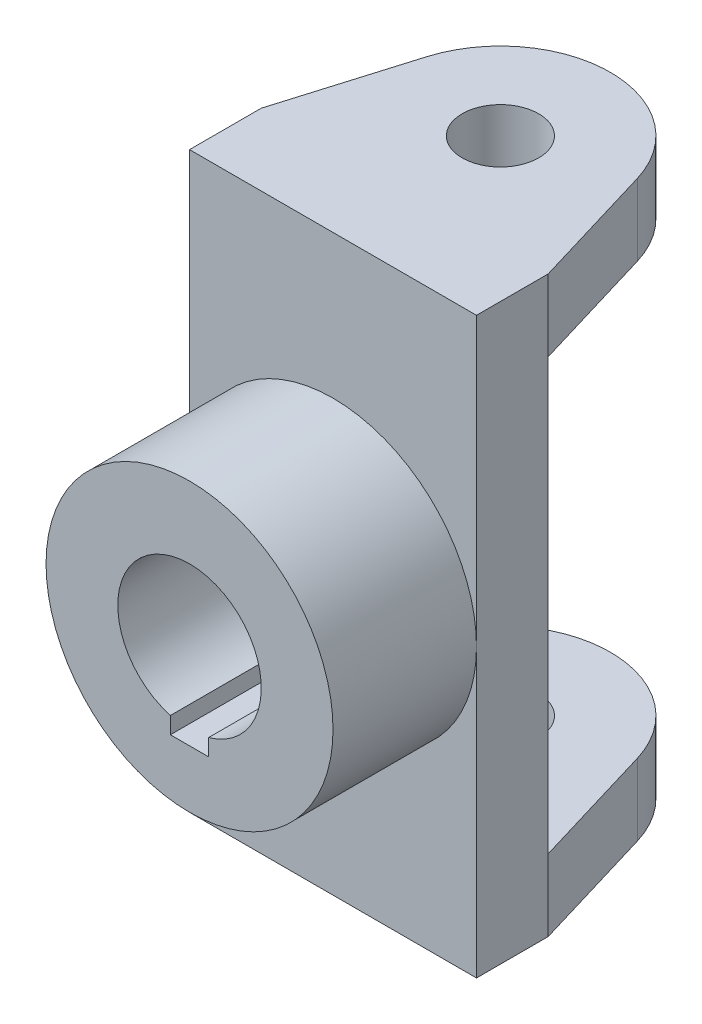
ISO-10303-21;
HEADER;
FILE_DESCRIPTION(('STEP AP214'),'2;1');
FILE_NAME('part.step','',(''),(''),'','','');
FILE_SCHEMA(('AUTOMOTIVE_DESIGN { 1 0 10303 214 1 1 1 1 }'));
ENDSEC;
DATA;
#1=APPLICATION_CONTEXT('core data for automotive mechanical design processes');
#2=APPLICATION_PROTOCOL_DEFINITION('international standard','automotive_design',2000,#1);
#3=PRODUCT_CONTEXT('',#1,'mechanical');
#4=PRODUCT('Part','Part','',(#3));
#5=PRODUCT_RELATED_PRODUCT_CATEGORY('part','',(#4));
#6=PRODUCT_DEFINITION_FORMATION('','',#4);
#7=PRODUCT_DEFINITION_CONTEXT('part definition',#1,'design');
#8=PRODUCT_DEFINITION('design','',#6,#7);
#9=PRODUCT_DEFINITION_SHAPE('','',#8);
#10=(LENGTH_UNIT() NAMED_UNIT(*) SI_UNIT(.MILLI.,.METRE.));
#11=(NAMED_UNIT(*) PLANE_ANGLE_UNIT() SI_UNIT($,.RADIAN.));
#12=(NAMED_UNIT(*) SI_UNIT($,.STERADIAN.) SOLID_ANGLE_UNIT());
#13=UNCERTAINTY_MEASURE_WITH_UNIT(LENGTH_MEASURE(1.E-05),#10,'distance_accuracy_value','');
#14=(GEOMETRIC_REPRESENTATION_CONTEXT(3) GLOBAL_UNCERTAINTY_ASSIGNED_CONTEXT((#13)) GLOBAL_UNIT_ASSIGNED_CONTEXT((#10,
#11,#12)) REPRESENTATION_CONTEXT('',''));
#15=CARTESIAN_POINT('',(0.,0.,0.));
#16=DIRECTION('',(0.,0.,1.));
#17=DIRECTION('',(1.,0.,0.));
#18=AXIS2_PLACEMENT_3D('',#15,#16,#17);
#19=CARTESIAN_POINT('',(0.,0.,-30.));
#20=DIRECTION('',(0.,0.,1.));
#21=DIRECTION('',(1.,0.,0.));
#22=AXIS2_PLACEMENT_3D('',#19,#20,#21);
#23=CYLINDRICAL_SURFACE('',#22,30.);
#24=CARTESIAN_POINT('',(0.,0.,-30.));
#25=DIRECTION('',(0.,0.,1.));
#26=DIRECTION('',(1.,0.,0.));
#27=AXIS2_PLACEMENT_3D('',#24,#25,#26);
#28=CIRCLE('',#27,30.);
#29=CARTESIAN_POINT('',(30.,0.,-30.));
#30=VERTEX_POINT('',#29);
#31=CARTESIAN_POINT('',(-30.,0.,-30.));
#32=VERTEX_POINT('',#31);
#33=EDGE_CURVE('E11',#30,#32,#28,.T.);
#34=ORIENTED_EDGE('',*,*,#33,.T.);
#35=EDGE_CURVE('E54',#32,#30,#28,.T.);
#36=ORIENTED_EDGE('',*,*,#35,.T.);
#37=EDGE_LOOP('',(#34,#36));
#38=FACE_BOUND('',#37,.T.);
#39=CARTESIAN_POINT('',(0.,0.,0.));
#40=DIRECTION('',(0.,0.,1.));
#41=DIRECTION('',(1.,0.,0.));
#42=AXIS2_PLACEMENT_3D('',#39,#40,#41);
#43=CIRCLE('',#42,30.);
#44=CARTESIAN_POINT('',(30.,0.,0.));
#45=VERTEX_POINT('',#44);
#46=EDGE_CURVE('E48',#45,#45,#43,.T.);
#47=ORIENTED_EDGE('',*,*,#46,.F.);
#48=EDGE_LOOP('',(#47));
#49=FACE_BOUND('',#48,.T.);
#50=ADVANCED_FACE('F45',(#38,#49),#23,.T.);
#51=CARTESIAN_POINT('',(0.,0.,0.));
#52=DIRECTION('',(0.,0.,1.));
#53=DIRECTION('',(1.,0.,0.));
#54=AXIS2_PLACEMENT_3D('',#51,#52,#53);
#55=PLANE('',#54);
#56=CARTESIAN_POINT('',(0.,0.,0.));
#57=DIRECTION('',(0.,0.,1.));
#58=DIRECTION('',(1.,0.,0.));
#59=AXIS2_PLACEMENT_3D('',#56,#57,#58);
#60=CIRCLE('',#59,15.);
#61=CARTESIAN_POINT('',(4.,-14.456832294801,0.));
#62=VERTEX_POINT('',#61);
#63=CARTESIAN_POINT('',(-4.,-14.456832294801,0.));
#64=VERTEX_POINT('',#63);
#65=EDGE_CURVE('E288',#62,#64,#60,.T.);
#66=ORIENTED_EDGE('',*,*,#65,.F.);
#67=DIRECTION('',(0.,1.,0.));
#68=VECTOR('',#67,1.);
#69=CARTESIAN_POINT('',(4.,-14.456832294801,0.));
#70=LINE('',#69,#68);
#71=CARTESIAN_POINT('',(4.,-17.956832294801,0.));
#72=VERTEX_POINT('',#71);
#73=EDGE_CURVE('E300',#72,#62,#70,.T.);
#74=ORIENTED_EDGE('',*,*,#73,.F.);
#75=DIRECTION('',(1.,0.,0.));
#76=VECTOR('',#75,1.);
#77=CARTESIAN_POINT('',(-4.,-17.956832294801,0.));
#78=LINE('',#77,#76);
#79=CARTESIAN_POINT('',(-4.,-17.956832294801,0.));
#80=VERTEX_POINT('',#79);
#81=EDGE_CURVE('E317',#80,#72,#78,.T.);
#82=ORIENTED_EDGE('',*,*,#81,.F.);
#83=DIRECTION('',(0.,-1.,0.));
#84=VECTOR('',#83,1.);
#85=CARTESIAN_POINT('',(-4.,-14.456832294801,0.));
#86=LINE('',#85,#84);
#87=EDGE_CURVE('E313',#64,#80,#86,.T.);
#88=ORIENTED_EDGE('',*,*,#87,.F.);
#89=EDGE_LOOP('',(#66,#74,#82,#88));
#90=FACE_BOUND('',#89,.T.);
#91=ORIENTED_EDGE('',*,*,#46,.T.);
#92=EDGE_LOOP('',(#91));
#93=FACE_BOUND('',#92,.T.);
#94=ADVANCED_FACE('F344',(#90,#93),#55,.T.);
#95=CARTESIAN_POINT('',(0.,0.,-30.));
#96=DIRECTION('',(0.,0.,1.));
#97=DIRECTION('',(1.,0.,0.));
#98=AXIS2_PLACEMENT_3D('',#95,#96,#97);
#99=CYLINDRICAL_SURFACE('',#98,15.);
#100=ORIENTED_EDGE('',*,*,#65,.T.);
#101=DIRECTION('',(0.,0.,1.));
#102=VECTOR('',#101,1.);
#103=CARTESIAN_POINT('',(-4.,-14.456832294801,-30.));
#104=LINE('',#103,#102);
#105=CARTESIAN_POINT('',(-4.,-14.456832294801,-30.));
#106=VERTEX_POINT('',#105);
#107=EDGE_CURVE('E310',#106,#64,#104,.T.);
#108=ORIENTED_EDGE('',*,*,#107,.F.);
#109=CARTESIAN_POINT('',(0.,0.,-30.));
#110=DIRECTION('',(0.,0.,1.));
#111=DIRECTION('',(1.,0.,0.));
#112=AXIS2_PLACEMENT_3D('',#109,#110,#111);
#113=CIRCLE('',#112,15.);
#114=CARTESIAN_POINT('',(4.,-14.456832294801,-30.));
#115=VERTEX_POINT('',#114);
#116=EDGE_CURVE('E295',#115,#106,#113,.T.);
#117=ORIENTED_EDGE('',*,*,#116,.F.);
#118=DIRECTION('',(0.,0.,1.));
#119=VECTOR('',#118,1.);
#120=CARTESIAN_POINT('',(4.,-14.456832294801,-30.));
#121=LINE('',#120,#119);
#122=EDGE_CURVE('E324',#115,#62,#121,.T.);
#123=ORIENTED_EDGE('',*,*,#122,.T.);
#124=EDGE_LOOP('',(#100,#108,#117,#123));
#125=FACE_BOUND('',#124,.T.);
#126=ADVANCED_FACE('F350',(#125),#99,.F.);
#127=CARTESIAN_POINT('',(4.,-14.456832294801,-30.));
#128=DIRECTION('',(1.,0.,0.));
#129=DIRECTION('',(0.,1.,0.));
#130=AXIS2_PLACEMENT_3D('',#127,#128,#129);
#131=PLANE('',#130);
#132=ORIENTED_EDGE('',*,*,#73,.T.);
#133=ORIENTED_EDGE('',*,*,#122,.F.);
#134=DIRECTION('',(0.,1.,0.));
#135=VECTOR('',#134,1.);
#136=CARTESIAN_POINT('',(4.,-14.456832294801,-30.));
#137=LINE('',#136,#135);
#138=CARTESIAN_POINT('',(4.,-17.956832294801,-30.));
#139=VERTEX_POINT('',#138);
#140=EDGE_CURVE('E306',#139,#115,#137,.T.);
#141=ORIENTED_EDGE('',*,*,#140,.F.);
#142=DIRECTION('',(0.,0.,1.));
#143=VECTOR('',#142,1.);
#144=CARTESIAN_POINT('',(4.,-17.956832294801,-30.));
#145=LINE('',#144,#143);
#146=EDGE_CURVE('E327',#139,#72,#145,.T.);
#147=ORIENTED_EDGE('',*,*,#146,.T.);
#148=EDGE_LOOP('',(#132,#133,#141,#147));
#149=FACE_BOUND('',#148,.T.);
#150=ADVANCED_FACE('F352',(#149),#131,.F.);
#151=CARTESIAN_POINT('',(-4.,-17.956832294801,-30.));
#152=DIRECTION('',(0.,-1.,0.));
#153=DIRECTION('',(0.,0.,-1.));
#154=AXIS2_PLACEMENT_3D('',#151,#152,#153);
#155=PLANE('',#154);
#156=ORIENTED_EDGE('',*,*,#81,.T.);
#157=ORIENTED_EDGE('',*,*,#146,.F.);
#158=DIRECTION('',(1.,0.,0.));
#159=VECTOR('',#158,1.);
#160=CARTESIAN_POINT('',(-4.,-17.956832294801,-30.));
#161=LINE('',#160,#159);
#162=CARTESIAN_POINT('',(-4.,-17.956832294801,-30.));
#163=VERTEX_POINT('',#162);
#164=EDGE_CURVE('E69',#163,#139,#161,.T.);
#165=ORIENTED_EDGE('',*,*,#164,.F.);
#166=DIRECTION('',(0.,0.,1.));
#167=VECTOR('',#166,1.);
#168=CARTESIAN_POINT('',(-4.,-17.956832294801,-30.));
#169=LINE('',#168,#167);
#170=EDGE_CURVE('E330',#163,#80,#169,.T.);
#171=ORIENTED_EDGE('',*,*,#170,.T.);
#172=EDGE_LOOP('',(#156,#157,#165,#171));
#173=FACE_BOUND('',#172,.T.);
#174=ADVANCED_FACE('F347',(#173),#155,.F.);
#175=CARTESIAN_POINT('',(-4.,-14.456832294801,-30.));
#176=DIRECTION('',(-1.,0.,0.));
#177=DIRECTION('',(0.,-1.,0.));
#178=AXIS2_PLACEMENT_3D('',#175,#176,#177);
#179=PLANE('',#178);
#180=ORIENTED_EDGE('',*,*,#87,.T.);
#181=ORIENTED_EDGE('',*,*,#170,.F.);
#182=DIRECTION('',(0.,-1.,0.));
#183=VECTOR('',#182,1.);
#184=CARTESIAN_POINT('',(-4.,-14.456832294801,-30.));
#185=LINE('',#184,#183);
#186=EDGE_CURVE('E299',#106,#163,#185,.T.);
#187=ORIENTED_EDGE('',*,*,#186,.F.);
#188=ORIENTED_EDGE('',*,*,#107,.T.);
#189=EDGE_LOOP('',(#180,#181,#187,#188));
#190=FACE_BOUND('',#189,.T.);
#191=ADVANCED_FACE('F338',(#190),#179,.F.);
#192=CARTESIAN_POINT('',(0.,0.,-30.));
#193=DIRECTION('',(0.,0.,-1.));
#194=DIRECTION('',(-1.,0.,0.));
#195=AXIS2_PLACEMENT_3D('',#192,#193,#194);
#196=PLANE('',#195);
#197=ORIENTED_EDGE('',*,*,#35,.F.);
#198=DIRECTION('',(0.,1.,0.));
#199=VECTOR('',#198,1.);
#200=CARTESIAN_POINT('',(-30.,45.,-30.));
#201=LINE('',#200,#199);
#202=CARTESIAN_POINT('',(-30.,-60.,-30.));
#203=VERTEX_POINT('',#202);
#204=EDGE_CURVE('E289',#203,#32,#201,.T.);
#205=ORIENTED_EDGE('',*,*,#204,.F.);
#206=DIRECTION('',(1.,0.,0.));
#207=VECTOR('',#206,1.);
#208=CARTESIAN_POINT('',(-30.,-60.,-30.));
#209=LINE('',#208,#207);
#210=CARTESIAN_POINT('',(30.,-60.,-30.));
#211=VERTEX_POINT('',#210);
#212=EDGE_CURVE('E180',#203,#211,#209,.T.);
#213=ORIENTED_EDGE('',*,*,#212,.T.);
#214=DIRECTION('',(0.,-1.,0.));
#215=VECTOR('',#214,1.);
#216=CARTESIAN_POINT('',(30.,45.,-30.));
#217=LINE('',#216,#215);
#218=EDGE_CURVE('E292',#30,#211,#217,.T.);
#219=ORIENTED_EDGE('',*,*,#218,.F.);
#220=EDGE_LOOP('',(#197,#205,#213,#219));
#221=FACE_BOUND('',#220,.T.);
#222=ADVANCED_FACE('F376',(#221),#196,.F.);
#223=CARTESIAN_POINT('',(0.,0.,-45.));
#224=DIRECTION('',(0.,0.,-1.));
#225=DIRECTION('',(-1.,0.,0.));
#226=AXIS2_PLACEMENT_3D('',#223,#224,#225);
#227=PLANE('',#226);
#228=DIRECTION('',(0.,1.,0.));
#229=VECTOR('',#228,1.);
#230=CARTESIAN_POINT('',(-30.,45.,-45.));
#231=LINE('',#230,#229);
#232=CARTESIAN_POINT('',(-30.,-45.,-45.));
#233=VERTEX_POINT('',#232);
#234=CARTESIAN_POINT('',(-30.,45.,-45.));
#235=VERTEX_POINT('',#234);
#236=EDGE_CURVE('E163',#233,#235,#231,.T.);
#237=ORIENTED_EDGE('',*,*,#236,.T.);
#238=DIRECTION('',(1.,0.,0.));
#239=VECTOR('',#238,1.);
#240=CARTESIAN_POINT('',(30.,45.,-45.));
#241=LINE('',#240,#239);
#242=CARTESIAN_POINT('',(30.,45.,-45.));
#243=VERTEX_POINT('',#242);
#244=EDGE_CURVE('E277',#235,#243,#241,.T.);
#245=ORIENTED_EDGE('',*,*,#244,.T.);
#246=DIRECTION('',(0.,-1.,0.));
#247=VECTOR('',#246,1.);
#248=CARTESIAN_POINT('',(30.,45.,-45.));
#249=LINE('',#248,#247);
#250=CARTESIAN_POINT('',(30.,-45.,-45.));
#251=VERTEX_POINT('',#250);
#252=EDGE_CURVE('E281',#243,#251,#249,.T.);
#253=ORIENTED_EDGE('',*,*,#252,.T.);
#254=DIRECTION('',(-1.,0.,0.));
#255=VECTOR('',#254,1.);
#256=CARTESIAN_POINT('',(30.,-45.,-45.));
#257=LINE('',#256,#255);
#258=EDGE_CURVE('E285',#251,#233,#257,.T.);
#259=ORIENTED_EDGE('',*,*,#258,.T.);
#260=EDGE_LOOP('',(#237,#245,#253,#259));
#261=FACE_BOUND('',#260,.T.);
#262=ADVANCED_FACE('F393',(#261),#227,.T.);
#263=CARTESIAN_POINT('',(30.,45.,-45.));
#264=DIRECTION('',(-1.,0.,0.));
#265=DIRECTION('',(0.,-1.,0.));
#266=AXIS2_PLACEMENT_3D('',#263,#264,#265);
#267=PLANE('',#266);
#268=CARTESIAN_POINT('',(30.,60.,-30.));
#269=VERTEX_POINT('',#268);
#270=EDGE_CURVE('E61',#269,#30,#217,.T.);
#271=ORIENTED_EDGE('',*,*,#270,.T.);
#272=ORIENTED_EDGE('',*,*,#218,.T.);
#273=DIRECTION('',(0.,0.,-1.));
#274=VECTOR('',#273,1.);
#275=CARTESIAN_POINT('',(30.,-60.,-45.));
#276=LINE('',#275,#274);
#277=CARTESIAN_POINT('',(30.,-60.,-45.));
#278=VERTEX_POINT('',#277);
#279=EDGE_CURVE('E196',#211,#278,#276,.T.);
#280=ORIENTED_EDGE('',*,*,#279,.T.);
#281=DIRECTION('',(0.,1.,0.));
#282=VECTOR('',#281,1.);
#283=CARTESIAN_POINT('',(30.,-60.,-45.));
#284=LINE('',#283,#282);
#285=EDGE_CURVE('E202',#278,#251,#284,.T.);
#286=ORIENTED_EDGE('',*,*,#285,.T.);
#287=ORIENTED_EDGE('',*,*,#252,.F.);
#288=DIRECTION('',(0.,-1.,0.));
#289=VECTOR('',#288,1.);
#290=CARTESIAN_POINT('',(30.,60.,-45.));
#291=LINE('',#290,#289);
#292=CARTESIAN_POINT('',(30.,60.,-45.));
#293=VERTEX_POINT('',#292);
#294=EDGE_CURVE('E270',#293,#243,#291,.T.);
#295=ORIENTED_EDGE('',*,*,#294,.F.);
#296=DIRECTION('',(0.,0.,-1.));
#297=VECTOR('',#296,1.);
#298=CARTESIAN_POINT('',(30.,60.,-45.));
#299=LINE('',#298,#297);
#300=EDGE_CURVE('E239',#269,#293,#299,.T.);
#301=ORIENTED_EDGE('',*,*,#300,.F.);
#302=EDGE_LOOP('',(#271,#272,#280,#286,#287,#295,#301));
#303=FACE_BOUND('',#302,.T.);
#304=ADVANCED_FACE('F383',(#303),#267,.F.);
#305=CARTESIAN_POINT('',(-30.,45.,-45.));
#306=DIRECTION('',(1.,0.,0.));
#307=DIRECTION('',(0.,1.,0.));
#308=AXIS2_PLACEMENT_3D('',#305,#306,#307);
#309=PLANE('',#308);
#310=ORIENTED_EDGE('',*,*,#204,.T.);
#311=CARTESIAN_POINT('',(-30.,60.,-30.));
#312=VERTEX_POINT('',#311);
#313=EDGE_CURVE('E274',#32,#312,#201,.T.);
#314=ORIENTED_EDGE('',*,*,#313,.T.);
#315=DIRECTION('',(0.,0.,1.));
#316=VECTOR('',#315,1.);
#317=CARTESIAN_POINT('',(-30.,60.,-45.));
#318=LINE('',#317,#316);
#319=CARTESIAN_POINT('',(-30.,60.,-45.));
#320=VERTEX_POINT('',#319);
#321=EDGE_CURVE('E230',#320,#312,#318,.T.);
#322=ORIENTED_EDGE('',*,*,#321,.F.);
#323=DIRECTION('',(0.,-1.,0.));
#324=VECTOR('',#323,1.);
#325=CARTESIAN_POINT('',(-30.,60.,-45.));
#326=LINE('',#325,#324);
#327=EDGE_CURVE('E251',#320,#235,#326,.T.);
#328=ORIENTED_EDGE('',*,*,#327,.T.);
#329=ORIENTED_EDGE('',*,*,#236,.F.);
#330=DIRECTION('',(0.,1.,0.));
#331=VECTOR('',#330,1.);
#332=CARTESIAN_POINT('',(-30.,-60.,-45.));
#333=LINE('',#332,#331);
#334=CARTESIAN_POINT('',(-30.,-60.,-45.));
#335=VERTEX_POINT('',#334);
#336=EDGE_CURVE('E155',#335,#233,#333,.T.);
#337=ORIENTED_EDGE('',*,*,#336,.F.);
#338=DIRECTION('',(0.,0.,1.));
#339=VECTOR('',#338,1.);
#340=CARTESIAN_POINT('',(-30.,-60.,-45.));
#341=LINE('',#340,#339);
#342=EDGE_CURVE('E159',#335,#203,#341,.T.);
#343=ORIENTED_EDGE('',*,*,#342,.T.);
#344=EDGE_LOOP('',(#310,#314,#322,#328,#329,#337,#343));
#345=FACE_BOUND('',#344,.T.);
#346=ADVANCED_FACE('F158',(#345),#309,.F.);
#347=ORIENTED_EDGE('',*,*,#33,.F.);
#348=ORIENTED_EDGE('',*,*,#270,.F.);
#349=DIRECTION('',(1.,0.,0.));
#350=VECTOR('',#349,1.);
#351=CARTESIAN_POINT('',(-30.,60.,-30.));
#352=LINE('',#351,#350);
#353=EDGE_CURVE('E234',#312,#269,#352,.T.);
#354=ORIENTED_EDGE('',*,*,#353,.F.);
#355=ORIENTED_EDGE('',*,*,#313,.F.);
#356=EDGE_LOOP('',(#347,#348,#354,#355));
#357=FACE_BOUND('',#356,.T.);
#358=ADVANCED_FACE('F379',(#357),#196,.F.);
#359=ORIENTED_EDGE('',*,*,#164,.T.);
#360=ORIENTED_EDGE('',*,*,#140,.T.);
#361=ORIENTED_EDGE('',*,*,#116,.T.);
#362=ORIENTED_EDGE('',*,*,#186,.T.);
#363=EDGE_LOOP('',(#359,#360,#361,#362));
#364=FACE_BOUND('',#363,.T.);
#365=ADVANCED_FACE('F349',(#364),#196,.F.);
#366=CARTESIAN_POINT('',(0.,60.,-65.));
#367=DIRECTION('',(0.,1.,0.));
#368=DIRECTION('',(-1.,0.,0.));
#369=AXIS2_PLACEMENT_3D('',#366,#367,#368);
#370=PLANE('',#369);
#371=ORIENTED_EDGE('',*,*,#321,.T.);
#372=ORIENTED_EDGE('',*,*,#353,.T.);
#373=ORIENTED_EDGE('',*,*,#300,.T.);
#374=DIRECTION('',(-0.286928155857607,0.,-0.957952103905071));
#375=VECTOR('',#374,1.);
#376=CARTESIAN_POINT('',(30.,60.,-45.));
#377=LINE('',#376,#375);
#378=CARTESIAN_POINT('',(22.0328983898167,60.,-71.599347584725));
#379=VERTEX_POINT('',#378);
#380=EDGE_CURVE('E242',#293,#379,#377,.T.);
#381=ORIENTED_EDGE('',*,*,#380,.T.);
#382=CARTESIAN_POINT('',(0.,60.,-65.));
#383=DIRECTION('',(0.,1.,0.));
#384=DIRECTION('',(-1.,0.,0.));
#385=AXIS2_PLACEMENT_3D('',#382,#383,#384);
#386=CIRCLE('',#385,23.);
#387=CARTESIAN_POINT('',(-22.0328983898166,60.,-71.599347584725));
#388=VERTEX_POINT('',#387);
#389=EDGE_CURVE('E245',#379,#388,#386,.T.);
#390=ORIENTED_EDGE('',*,*,#389,.T.);
#391=DIRECTION('',(-0.286928155857607,0.,0.957952103905071));
#392=VECTOR('',#391,1.);
#393=CARTESIAN_POINT('',(-30.,60.,-45.));
#394=LINE('',#393,#392);
#395=EDGE_CURVE('E248',#388,#320,#394,.T.);
#396=ORIENTED_EDGE('',*,*,#395,.T.);
#397=EDGE_LOOP('',(#371,#372,#373,#381,#390,#396));
#398=FACE_BOUND('',#397,.T.);
#399=CARTESIAN_POINT('',(0.,60.,-65.));
#400=DIRECTION('',(0.,1.,0.));
#401=DIRECTION('',(-1.,0.,0.));
#402=AXIS2_PLACEMENT_3D('',#399,#400,#401);
#403=CIRCLE('',#402,8.);
#404=CARTESIAN_POINT('',(-8.,60.,-65.));
#405=VERTEX_POINT('',#404);
#406=EDGE_CURVE('E222',#405,#405,#403,.T.);
#407=ORIENTED_EDGE('',*,*,#406,.F.);
#408=EDGE_LOOP('',(#407));
#409=FACE_BOUND('',#408,.T.);
#410=ADVANCED_FACE('F405',(#398,#409),#370,.T.);
#411=CARTESIAN_POINT('',(0.,45.,-65.));
#412=DIRECTION('',(0.,1.,0.));
#413=DIRECTION('',(-1.,0.,0.));
#414=AXIS2_PLACEMENT_3D('',#411,#412,#413);
#415=PLANE('',#414);
#416=ORIENTED_EDGE('',*,*,#244,.F.);
#417=DIRECTION('',(-0.286928155857607,0.,0.957952103905071));
#418=VECTOR('',#417,1.);
#419=CARTESIAN_POINT('',(-30.,45.,-45.));
#420=LINE('',#419,#418);
#421=CARTESIAN_POINT('',(-22.0328983898166,45.,-71.599347584725));
#422=VERTEX_POINT('',#421);
#423=EDGE_CURVE('E235',#422,#235,#420,.T.);
#424=ORIENTED_EDGE('',*,*,#423,.F.);
#425=CARTESIAN_POINT('',(0.,45.,-65.));
#426=DIRECTION('',(0.,1.,0.));
#427=DIRECTION('',(-1.,0.,0.));
#428=AXIS2_PLACEMENT_3D('',#425,#426,#427);
#429=CIRCLE('',#428,23.);
#430=CARTESIAN_POINT('',(22.0328983898167,45.,-71.599347584725));
#431=VERTEX_POINT('',#430);
#432=EDGE_CURVE('E254',#431,#422,#429,.T.);
#433=ORIENTED_EDGE('',*,*,#432,.F.);
#434=DIRECTION('',(-0.286928155857607,0.,-0.957952103905071));
#435=VECTOR('',#434,1.);
#436=CARTESIAN_POINT('',(30.,45.,-45.));
#437=LINE('',#436,#435);
#438=EDGE_CURVE('E226',#243,#431,#437,.T.);
#439=ORIENTED_EDGE('',*,*,#438,.F.);
#440=EDGE_LOOP('',(#416,#424,#433,#439));
#441=FACE_BOUND('',#440,.T.);
#442=CARTESIAN_POINT('',(0.,45.,-65.));
#443=DIRECTION('',(0.,1.,0.));
#444=DIRECTION('',(-1.,0.,0.));
#445=AXIS2_PLACEMENT_3D('',#442,#443,#444);
#446=CIRCLE('',#445,8.);
#447=CARTESIAN_POINT('',(-8.,45.,-65.));
#448=VERTEX_POINT('',#447);
#449=EDGE_CURVE('E169',#448,#448,#446,.T.);
#450=ORIENTED_EDGE('',*,*,#449,.T.);
#451=EDGE_LOOP('',(#450));
#452=FACE_BOUND('',#451,.T.);
#453=ADVANCED_FACE('F396',(#441,#452),#415,.F.);
#454=CARTESIAN_POINT('',(30.,60.,-45.));
#455=DIRECTION('',(-0.957952103905072,0.,0.286928155857607));
#456=DIRECTION('',(0.286928155857607,0.,0.957952103905072));
#457=AXIS2_PLACEMENT_3D('',#454,#455,#456);
#458=PLANE('',#457);
#459=ORIENTED_EDGE('',*,*,#438,.T.);
#460=DIRECTION('',(0.,-1.,0.));
#461=VECTOR('',#460,1.);
#462=CARTESIAN_POINT('',(22.0328983898167,60.,-71.599347584725));
#463=LINE('',#462,#461);
#464=EDGE_CURVE('E266',#379,#431,#463,.T.);
#465=ORIENTED_EDGE('',*,*,#464,.F.);
#466=ORIENTED_EDGE('',*,*,#380,.F.);
#467=ORIENTED_EDGE('',*,*,#294,.T.);
#468=EDGE_LOOP('',(#459,#465,#466,#467));
#469=FACE_BOUND('',#468,.T.);
#470=ADVANCED_FACE('F412',(#469),#458,.F.);
#471=CARTESIAN_POINT('',(0.,60.,-65.));
#472=DIRECTION('',(0.,-1.,0.));
#473=DIRECTION('',(1.,0.,0.));
#474=AXIS2_PLACEMENT_3D('',#471,#472,#473);
#475=CYLINDRICAL_SURFACE('',#474,23.);
#476=ORIENTED_EDGE('',*,*,#432,.T.);
#477=DIRECTION('',(0.,-1.,0.));
#478=VECTOR('',#477,1.);
#479=CARTESIAN_POINT('',(-22.0328983898166,60.,-71.599347584725));
#480=LINE('',#479,#478);
#481=EDGE_CURVE('E262',#388,#422,#480,.T.);
#482=ORIENTED_EDGE('',*,*,#481,.F.);
#483=ORIENTED_EDGE('',*,*,#389,.F.);
#484=ORIENTED_EDGE('',*,*,#464,.T.);
#485=EDGE_LOOP('',(#476,#482,#483,#484));
#486=FACE_BOUND('',#485,.T.);
#487=ADVANCED_FACE('F410',(#486),#475,.T.);
#488=CARTESIAN_POINT('',(-30.,60.,-45.));
#489=DIRECTION('',(0.957952103905071,0.,0.286928155857607));
#490=DIRECTION('',(0.286928155857607,0.,-0.957952103905071));
#491=AXIS2_PLACEMENT_3D('',#488,#489,#490);
#492=PLANE('',#491);
#493=ORIENTED_EDGE('',*,*,#423,.T.);
#494=ORIENTED_EDGE('',*,*,#327,.F.);
#495=ORIENTED_EDGE('',*,*,#395,.F.);
#496=ORIENTED_EDGE('',*,*,#481,.T.);
#497=EDGE_LOOP('',(#493,#494,#495,#496));
#498=FACE_BOUND('',#497,.T.);
#499=ADVANCED_FACE('F401',(#498),#492,.F.);
#500=CARTESIAN_POINT('',(0.,60.,-65.));
#501=DIRECTION('',(0.,-1.,0.));
#502=DIRECTION('',(1.,0.,0.));
#503=AXIS2_PLACEMENT_3D('',#500,#501,#502);
#504=CYLINDRICAL_SURFACE('',#503,8.);
#505=ORIENTED_EDGE('',*,*,#406,.T.);
#506=EDGE_LOOP('',(#505));
#507=FACE_BOUND('',#506,.T.);
#508=ORIENTED_EDGE('',*,*,#449,.F.);
#509=EDGE_LOOP('',(#508));
#510=FACE_BOUND('',#509,.T.);
#511=ADVANCED_FACE('F444',(#507,#510),#504,.F.);
#512=CARTESIAN_POINT('',(-30.,-60.,-45.));
#513=DIRECTION('',(-0.957952103905071,0.,-0.286928155857607));
#514=DIRECTION('',(-0.286928155857607,0.,0.957952103905071));
#515=AXIS2_PLACEMENT_3D('',#512,#513,#514);
#516=PLANE('',#515);
#517=DIRECTION('',(-0.286928155857607,0.,0.957952103905071));
#518=VECTOR('',#517,1.);
#519=CARTESIAN_POINT('',(-30.,-45.,-45.));
#520=LINE('',#519,#518);
#521=CARTESIAN_POINT('',(-22.0328983898166,-45.,-71.599347584725));
#522=VERTEX_POINT('',#521);
#523=EDGE_CURVE('E203',#522,#233,#520,.T.);
#524=ORIENTED_EDGE('',*,*,#523,.F.);
#525=DIRECTION('',(0.,1.,0.));
#526=VECTOR('',#525,1.);
#527=CARTESIAN_POINT('',(-22.0328983898166,-60.,-71.599347584725));
#528=LINE('',#527,#526);
#529=CARTESIAN_POINT('',(-22.0328983898166,-60.,-71.599347584725));
#530=VERTEX_POINT('',#529);
#531=EDGE_CURVE('E170',#530,#522,#528,.T.);
#532=ORIENTED_EDGE('',*,*,#531,.F.);
#533=DIRECTION('',(-0.286928155857607,0.,0.957952103905071));
#534=VECTOR('',#533,1.);
#535=CARTESIAN_POINT('',(-30.,-60.,-45.));
#536=LINE('',#535,#534);
#537=EDGE_CURVE('E176',#530,#335,#536,.T.);
#538=ORIENTED_EDGE('',*,*,#537,.T.);
#539=ORIENTED_EDGE('',*,*,#336,.T.);
#540=EDGE_LOOP('',(#524,#532,#538,#539));
#541=FACE_BOUND('',#540,.T.);
#542=ADVANCED_FACE('F184',(#541),#516,.T.);
#543=CARTESIAN_POINT('',(0.,-60.,-65.));
#544=DIRECTION('',(0.,1.,0.));
#545=DIRECTION('',(-1.,0.,0.));
#546=AXIS2_PLACEMENT_3D('',#543,#544,#545);
#547=CYLINDRICAL_SURFACE('',#546,23.);
#548=CARTESIAN_POINT('',(0.,-45.,-65.));
#549=DIRECTION('',(0.,1.,0.));
#550=DIRECTION('',(-1.,0.,0.));
#551=AXIS2_PLACEMENT_3D('',#548,#549,#550);
#552=CIRCLE('',#551,23.);
#553=CARTESIAN_POINT('',(22.0328983898167,-45.,-71.599347584725));
#554=VERTEX_POINT('',#553);
#555=EDGE_CURVE('E206',#554,#522,#552,.T.);
#556=ORIENTED_EDGE('',*,*,#555,.F.);
#557=DIRECTION('',(0.,1.,0.));
#558=VECTOR('',#557,1.);
#559=CARTESIAN_POINT('',(22.0328983898167,-60.,-71.599347584725));
#560=LINE('',#559,#558);
#561=CARTESIAN_POINT('',(22.0328983898167,-60.,-71.599347584725));
#562=VERTEX_POINT('',#561);
#563=EDGE_CURVE('E217',#562,#554,#560,.T.);
#564=ORIENTED_EDGE('',*,*,#563,.F.);
#565=CARTESIAN_POINT('',(0.,-60.,-65.));
#566=DIRECTION('',(0.,1.,0.));
#567=DIRECTION('',(-1.,0.,0.));
#568=AXIS2_PLACEMENT_3D('',#565,#566,#567);
#569=CIRCLE('',#568,23.);
#570=EDGE_CURVE('E186',#562,#530,#569,.T.);
#571=ORIENTED_EDGE('',*,*,#570,.T.);
#572=ORIENTED_EDGE('',*,*,#531,.T.);
#573=EDGE_LOOP('',(#556,#564,#571,#572));
#574=FACE_BOUND('',#573,.T.);
#575=ADVANCED_FACE('F453',(#574),#547,.T.);
#576=CARTESIAN_POINT('',(30.,-60.,-45.));
#577=DIRECTION('',(0.957952103905072,0.,-0.286928155857607));
#578=DIRECTION('',(-0.286928155857607,0.,-0.957952103905072));
#579=AXIS2_PLACEMENT_3D('',#576,#577,#578);
#580=PLANE('',#579);
#581=DIRECTION('',(-0.286928155857607,0.,-0.957952103905071));
#582=VECTOR('',#581,1.);
#583=CARTESIAN_POINT('',(30.,-45.,-45.));
#584=LINE('',#583,#582);
#585=EDGE_CURVE('E182',#251,#554,#584,.T.);
#586=ORIENTED_EDGE('',*,*,#585,.F.);
#587=ORIENTED_EDGE('',*,*,#285,.F.);
#588=DIRECTION('',(-0.286928155857607,0.,-0.957952103905071));
#589=VECTOR('',#588,1.);
#590=CARTESIAN_POINT('',(30.,-60.,-45.));
#591=LINE('',#590,#589);
#592=EDGE_CURVE('E189',#278,#562,#591,.T.);
#593=ORIENTED_EDGE('',*,*,#592,.T.);
#594=ORIENTED_EDGE('',*,*,#563,.T.);
#595=EDGE_LOOP('',(#586,#587,#593,#594));
#596=FACE_BOUND('',#595,.T.);
#597=ADVANCED_FACE('F387',(#596),#580,.T.);
#598=CARTESIAN_POINT('',(0.,-60.,-65.));
#599=DIRECTION('',(0.,-1.,0.));
#600=DIRECTION('',(-1.,0.,0.));
#601=AXIS2_PLACEMENT_3D('',#598,#599,#600);
#602=PLANE('',#601);
#603=CARTESIAN_POINT('',(0.,-60.,-65.));
#604=DIRECTION('',(0.,1.,0.));
#605=DIRECTION('',(-1.,0.,0.));
#606=AXIS2_PLACEMENT_3D('',#603,#604,#605);
#607=CIRCLE('',#606,8.);
#608=CARTESIAN_POINT('',(-8.,-60.,-65.));
#609=VERTEX_POINT('',#608);
#610=EDGE_CURVE('E207',#609,#609,#607,.T.);
#611=ORIENTED_EDGE('',*,*,#610,.T.);
#612=EDGE_LOOP('',(#611));
#613=FACE_BOUND('',#612,.T.);
#614=ORIENTED_EDGE('',*,*,#342,.F.);
#615=ORIENTED_EDGE('',*,*,#537,.F.);
#616=ORIENTED_EDGE('',*,*,#570,.F.);
#617=ORIENTED_EDGE('',*,*,#592,.F.);
#618=ORIENTED_EDGE('',*,*,#279,.F.);
#619=ORIENTED_EDGE('',*,*,#212,.F.);
#620=EDGE_LOOP('',(#614,#615,#616,#617,#618,#619));
#621=FACE_BOUND('',#620,.T.);
#622=ADVANCED_FACE('F174',(#613,#621),#602,.T.);
#623=CARTESIAN_POINT('',(0.,-45.,-65.));
#624=DIRECTION('',(0.,-1.,0.));
#625=DIRECTION('',(-1.,0.,0.));
#626=AXIS2_PLACEMENT_3D('',#623,#624,#625);
#627=PLANE('',#626);
#628=ORIENTED_EDGE('',*,*,#258,.F.);
#629=ORIENTED_EDGE('',*,*,#585,.T.);
#630=ORIENTED_EDGE('',*,*,#555,.T.);
#631=ORIENTED_EDGE('',*,*,#523,.T.);
#632=EDGE_LOOP('',(#628,#629,#630,#631));
#633=FACE_BOUND('',#632,.T.);
#634=CARTESIAN_POINT('',(0.,-45.,-65.));
#635=DIRECTION('',(0.,1.,0.));
#636=DIRECTION('',(-1.,0.,0.));
#637=AXIS2_PLACEMENT_3D('',#634,#635,#636);
#638=CIRCLE('',#637,8.);
#639=CARTESIAN_POINT('',(-8.,-45.,-65.));
#640=VERTEX_POINT('',#639);
#641=EDGE_CURVE('E482',#640,#640,#638,.T.);
#642=ORIENTED_EDGE('',*,*,#641,.F.);
#643=EDGE_LOOP('',(#642));
#644=FACE_BOUND('',#643,.T.);
#645=ADVANCED_FACE('F465',(#633,#644),#627,.F.);
#646=CARTESIAN_POINT('',(0.,-60.,-65.));
#647=DIRECTION('',(0.,1.,0.));
#648=DIRECTION('',(-1.,0.,0.));
#649=AXIS2_PLACEMENT_3D('',#646,#647,#648);
#650=CYLINDRICAL_SURFACE('',#649,8.);
#651=ORIENTED_EDGE('',*,*,#610,.F.);
#652=EDGE_LOOP('',(#651));
#653=FACE_BOUND('',#652,.T.);
#654=ORIENTED_EDGE('',*,*,#641,.T.);
#655=EDGE_LOOP('',(#654));
#656=FACE_BOUND('',#655,.T.);
#657=ADVANCED_FACE('F468',(#653,#656),#650,.F.);
#658=CLOSED_SHELL('',(#50,#94,#126,#150,#174,#191,#222,#262,#304,#346,#358,#365,#410,#453,#470,
#487,#499,#511,#542,#575,#597,#622,#645,#657));
#659=MANIFOLD_SOLID_BREP('B2',#658);
#660=ADVANCED_BREP_SHAPE_REPRESENTATION('',(#18,#659),#14);
#661=SHAPE_DEFINITION_REPRESENTATION(#9,#660);
ENDSEC;
END-ISO-10303-21;
